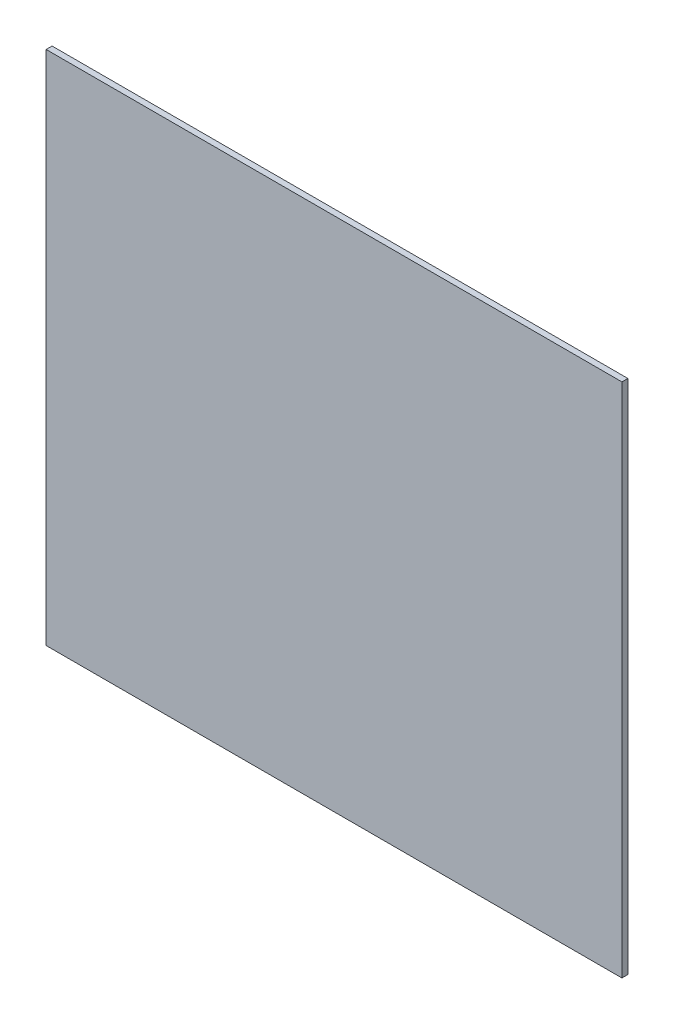
ISO-10303-21;
HEADER;
FILE_DESCRIPTION(('STEP AP214'),'2;1');
FILE_NAME('part.step','',(''),(''),'','','');
FILE_SCHEMA(('AUTOMOTIVE_DESIGN { 1 0 10303 214 1 1 1 1 }'));
ENDSEC;
DATA;
#1=APPLICATION_CONTEXT('core data for automotive mechanical design processes');
#2=APPLICATION_PROTOCOL_DEFINITION('international standard','automotive_design',2000,#1);
#3=PRODUCT_CONTEXT('',#1,'mechanical');
#4=PRODUCT('Part','Part','',(#3));
#5=PRODUCT_RELATED_PRODUCT_CATEGORY('part','',(#4));
#6=PRODUCT_DEFINITION_FORMATION('','',#4);
#7=PRODUCT_DEFINITION_CONTEXT('part definition',#1,'design');
#8=PRODUCT_DEFINITION('design','',#6,#7);
#9=PRODUCT_DEFINITION_SHAPE('','',#8);
#10=(LENGTH_UNIT() NAMED_UNIT(*) SI_UNIT(.MILLI.,.METRE.));
#11=(NAMED_UNIT(*) PLANE_ANGLE_UNIT() SI_UNIT($,.RADIAN.));
#12=(NAMED_UNIT(*) SI_UNIT($,.STERADIAN.) SOLID_ANGLE_UNIT());
#13=UNCERTAINTY_MEASURE_WITH_UNIT(LENGTH_MEASURE(1.E-05),#10,'distance_accuracy_value','');
#14=(GEOMETRIC_REPRESENTATION_CONTEXT(3) GLOBAL_UNCERTAINTY_ASSIGNED_CONTEXT((#13)) GLOBAL_UNIT_ASSIGNED_CONTEXT((#10,
#11,#12)) REPRESENTATION_CONTEXT('',''));
#15=CARTESIAN_POINT('',(0.,0.,0.));
#16=DIRECTION('',(0.,0.,1.));
#17=DIRECTION('',(1.,0.,0.));
#18=AXIS2_PLACEMENT_3D('',#15,#16,#17);
#19=CARTESIAN_POINT('',(-145.,130.,3.));
#20=DIRECTION('',(1.,0.,0.));
#21=DIRECTION('',(0.,1.,0.));
#22=AXIS2_PLACEMENT_3D('',#19,#20,#21);
#23=PLANE('',#22);
#24=DIRECTION('',(0.,-1.,0.));
#25=VECTOR('',#24,1.);
#26=CARTESIAN_POINT('',(-145.,130.,0.));
#27=LINE('',#26,#25);
#28=CARTESIAN_POINT('',(-145.,130.,0.));
#29=VERTEX_POINT('',#28);
#30=CARTESIAN_POINT('',(-145.,-130.,0.));
#31=VERTEX_POINT('',#30);
#32=EDGE_CURVE('E104',#29,#31,#27,.T.);
#33=ORIENTED_EDGE('',*,*,#32,.T.);
#34=DIRECTION('',(0.,0.,-1.));
#35=VECTOR('',#34,1.);
#36=CARTESIAN_POINT('',(-145.,-130.,3.));
#37=LINE('',#36,#35);
#38=CARTESIAN_POINT('',(-145.,-130.,3.));
#39=VERTEX_POINT('',#38);
#40=EDGE_CURVE('E11',#39,#31,#37,.T.);
#41=ORIENTED_EDGE('',*,*,#40,.F.);
#42=DIRECTION('',(0.,-1.,0.));
#43=VECTOR('',#42,1.);
#44=CARTESIAN_POINT('',(-145.,130.,3.));
#45=LINE('',#44,#43);
#46=CARTESIAN_POINT('',(-145.,130.,3.));
#47=VERTEX_POINT('',#46);
#48=EDGE_CURVE('E92',#47,#39,#45,.T.);
#49=ORIENTED_EDGE('',*,*,#48,.F.);
#50=DIRECTION('',(0.,0.,-1.));
#51=VECTOR('',#50,1.);
#52=CARTESIAN_POINT('',(-145.,130.,3.));
#53=LINE('',#52,#51);
#54=EDGE_CURVE('E100',#47,#29,#53,.T.);
#55=ORIENTED_EDGE('',*,*,#54,.T.);
#56=EDGE_LOOP('',(#33,#41,#49,#55));
#57=FACE_BOUND('',#56,.T.);
#58=ADVANCED_FACE('F41',(#57),#23,.F.);
#59=CARTESIAN_POINT('',(145.,-130.,3.));
#60=DIRECTION('',(0.,1.,0.));
#61=DIRECTION('',(-1.,0.,0.));
#62=AXIS2_PLACEMENT_3D('',#59,#60,#61);
#63=PLANE('',#62);
#64=DIRECTION('',(1.,0.,0.));
#65=VECTOR('',#64,1.);
#66=CARTESIAN_POINT('',(145.,-130.,0.));
#67=LINE('',#66,#65);
#68=CARTESIAN_POINT('',(145.,-130.,0.));
#69=VERTEX_POINT('',#68);
#70=EDGE_CURVE('E96',#31,#69,#67,.T.);
#71=ORIENTED_EDGE('',*,*,#70,.T.);
#72=DIRECTION('',(0.,0.,-1.));
#73=VECTOR('',#72,1.);
#74=CARTESIAN_POINT('',(145.,-130.,3.));
#75=LINE('',#74,#73);
#76=CARTESIAN_POINT('',(145.,-130.,3.));
#77=VERTEX_POINT('',#76);
#78=EDGE_CURVE('E49',#77,#69,#75,.T.);
#79=ORIENTED_EDGE('',*,*,#78,.F.);
#80=DIRECTION('',(1.,0.,0.));
#81=VECTOR('',#80,1.);
#82=CARTESIAN_POINT('',(145.,-130.,3.));
#83=LINE('',#82,#81);
#84=EDGE_CURVE('E87',#39,#77,#83,.T.);
#85=ORIENTED_EDGE('',*,*,#84,.F.);
#86=ORIENTED_EDGE('',*,*,#40,.T.);
#87=EDGE_LOOP('',(#71,#79,#85,#86));
#88=FACE_BOUND('',#87,.T.);
#89=ADVANCED_FACE('F95',(#88),#63,.F.);
#90=CARTESIAN_POINT('',(145.,130.,3.));
#91=DIRECTION('',(-1.,0.,0.));
#92=DIRECTION('',(0.,-1.,0.));
#93=AXIS2_PLACEMENT_3D('',#90,#91,#92);
#94=PLANE('',#93);
#95=DIRECTION('',(0.,1.,0.));
#96=VECTOR('',#95,1.);
#97=CARTESIAN_POINT('',(145.,130.,0.));
#98=LINE('',#97,#96);
#99=CARTESIAN_POINT('',(145.,130.,0.));
#100=VERTEX_POINT('',#99);
#101=EDGE_CURVE('E74',#69,#100,#98,.T.);
#102=ORIENTED_EDGE('',*,*,#101,.T.);
#103=DIRECTION('',(0.,0.,-1.));
#104=VECTOR('',#103,1.);
#105=CARTESIAN_POINT('',(145.,130.,3.));
#106=LINE('',#105,#104);
#107=CARTESIAN_POINT('',(145.,130.,3.));
#108=VERTEX_POINT('',#107);
#109=EDGE_CURVE('E97',#108,#100,#106,.T.);
#110=ORIENTED_EDGE('',*,*,#109,.F.);
#111=DIRECTION('',(0.,1.,0.));
#112=VECTOR('',#111,1.);
#113=CARTESIAN_POINT('',(145.,130.,3.));
#114=LINE('',#113,#112);
#115=EDGE_CURVE('E90',#77,#108,#114,.T.);
#116=ORIENTED_EDGE('',*,*,#115,.F.);
#117=ORIENTED_EDGE('',*,*,#78,.T.);
#118=EDGE_LOOP('',(#102,#110,#116,#117));
#119=FACE_BOUND('',#118,.T.);
#120=ADVANCED_FACE('F98',(#119),#94,.F.);
#121=CARTESIAN_POINT('',(145.,130.,3.));
#122=DIRECTION('',(0.,-1.,0.));
#123=DIRECTION('',(1.,0.,0.));
#124=AXIS2_PLACEMENT_3D('',#121,#122,#123);
#125=PLANE('',#124);
#126=DIRECTION('',(-1.,0.,0.));
#127=VECTOR('',#126,1.);
#128=CARTESIAN_POINT('',(145.,130.,0.));
#129=LINE('',#128,#127);
#130=EDGE_CURVE('E80',#100,#29,#129,.T.);
#131=ORIENTED_EDGE('',*,*,#130,.T.);
#132=ORIENTED_EDGE('',*,*,#54,.F.);
#133=DIRECTION('',(-1.,0.,0.));
#134=VECTOR('',#133,1.);
#135=CARTESIAN_POINT('',(145.,130.,3.));
#136=LINE('',#135,#134);
#137=EDGE_CURVE('E57',#108,#47,#136,.T.);
#138=ORIENTED_EDGE('',*,*,#137,.F.);
#139=ORIENTED_EDGE('',*,*,#109,.T.);
#140=EDGE_LOOP('',(#131,#132,#138,#139));
#141=FACE_BOUND('',#140,.T.);
#142=ADVANCED_FACE('F111',(#141),#125,.F.);
#143=CARTESIAN_POINT('',(0.,0.,3.));
#144=DIRECTION('',(0.,0.,-1.));
#145=DIRECTION('',(-1.,0.,0.));
#146=AXIS2_PLACEMENT_3D('',#143,#144,#145);
#147=PLANE('',#146);
#148=ORIENTED_EDGE('',*,*,#48,.T.);
#149=ORIENTED_EDGE('',*,*,#84,.T.);
#150=ORIENTED_EDGE('',*,*,#115,.T.);
#151=ORIENTED_EDGE('',*,*,#137,.T.);
#152=EDGE_LOOP('',(#148,#149,#150,#151));
#153=FACE_BOUND('',#152,.T.);
#154=ADVANCED_FACE('F88',(#153),#147,.F.);
#155=CARTESIAN_POINT('',(0.,0.,0.));
#156=DIRECTION('',(0.,0.,-1.));
#157=DIRECTION('',(-1.,0.,0.));
#158=AXIS2_PLACEMENT_3D('',#155,#156,#157);
#159=PLANE('',#158);
#160=ORIENTED_EDGE('',*,*,#32,.F.);
#161=ORIENTED_EDGE('',*,*,#130,.F.);
#162=ORIENTED_EDGE('',*,*,#101,.F.);
#163=ORIENTED_EDGE('',*,*,#70,.F.);
#164=EDGE_LOOP('',(#160,#161,#162,#163));
#165=FACE_BOUND('',#164,.T.);
#166=ADVANCED_FACE('F114',(#165),#159,.T.);
#167=CLOSED_SHELL('',(#58,#89,#120,#142,#154,#166));
#168=MANIFOLD_SOLID_BREP('B2',#167);
#169=ADVANCED_BREP_SHAPE_REPRESENTATION('',(#18,#168),#14);
#170=SHAPE_DEFINITION_REPRESENTATION(#9,#169);
ENDSEC;
END-ISO-10303-21;
